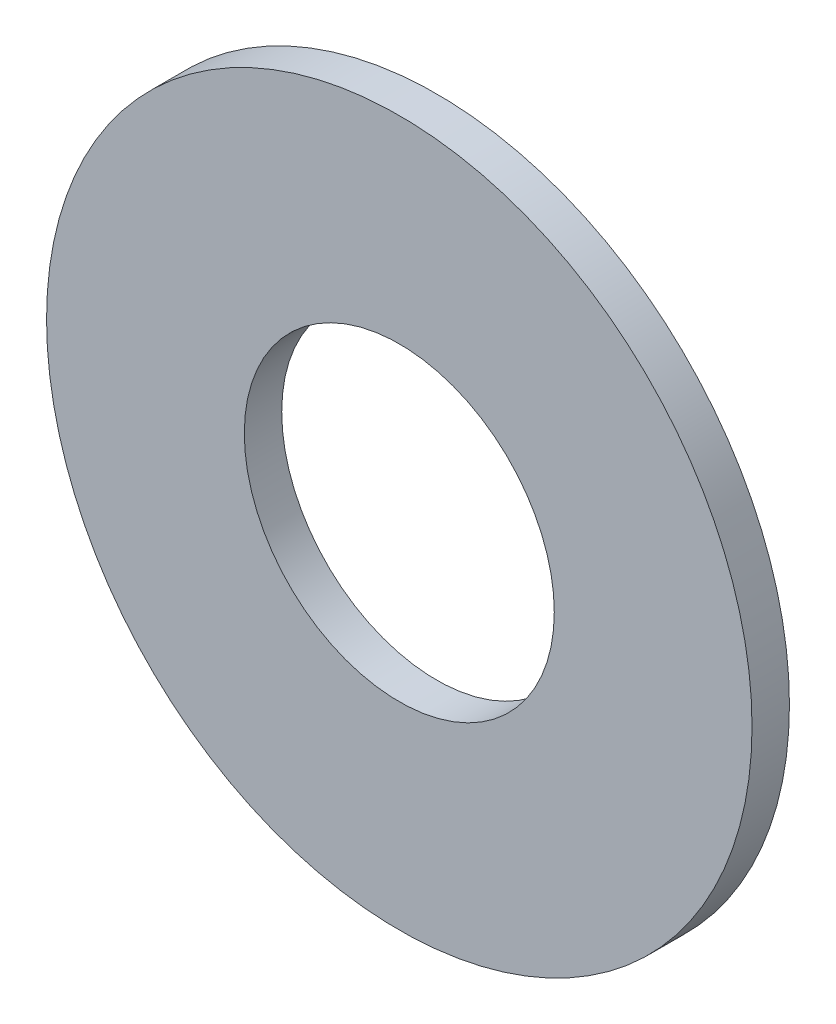
ISO-10303-21;
HEADER;
FILE_DESCRIPTION(('STEP AP214'),'2;1');
FILE_NAME('part.step','',(''),(''),'','','');
FILE_SCHEMA(('AUTOMOTIVE_DESIGN { 1 0 10303 214 1 1 1 1 }'));
ENDSEC;
DATA;
#1=APPLICATION_CONTEXT('core data for automotive mechanical design processes');
#2=APPLICATION_PROTOCOL_DEFINITION('international standard','automotive_design',2000,#1);
#3=PRODUCT_CONTEXT('',#1,'mechanical');
#4=PRODUCT('Part','Part','',(#3));
#5=PRODUCT_RELATED_PRODUCT_CATEGORY('part','',(#4));
#6=PRODUCT_DEFINITION_FORMATION('','',#4);
#7=PRODUCT_DEFINITION_CONTEXT('part definition',#1,'design');
#8=PRODUCT_DEFINITION('design','',#6,#7);
#9=PRODUCT_DEFINITION_SHAPE('','',#8);
#10=(LENGTH_UNIT() NAMED_UNIT(*) SI_UNIT(.MILLI.,.METRE.));
#11=(NAMED_UNIT(*) PLANE_ANGLE_UNIT() SI_UNIT($,.RADIAN.));
#12=(NAMED_UNIT(*) SI_UNIT($,.STERADIAN.) SOLID_ANGLE_UNIT());
#13=UNCERTAINTY_MEASURE_WITH_UNIT(LENGTH_MEASURE(1.E-05),#10,'distance_accuracy_value','');
#14=(GEOMETRIC_REPRESENTATION_CONTEXT(3) GLOBAL_UNCERTAINTY_ASSIGNED_CONTEXT((#13)) GLOBAL_UNIT_ASSIGNED_CONTEXT((#10,
#11,#12)) REPRESENTATION_CONTEXT('',''));
#15=CARTESIAN_POINT('',(0.,0.,0.));
#16=DIRECTION('',(0.,0.,1.));
#17=DIRECTION('',(1.,0.,0.));
#18=AXIS2_PLACEMENT_3D('',#15,#16,#17);
#19=CARTESIAN_POINT('',(0.,0.,1.75));
#20=DIRECTION('',(0.,0.,1.));
#21=DIRECTION('',(1.,0.,0.));
#22=AXIS2_PLACEMENT_3D('',#19,#20,#21);
#23=PLANE('',#22);
#24=CARTESIAN_POINT('',(0.,0.,1.75));
#25=DIRECTION('',(0.,0.,1.));
#26=DIRECTION('',(1.,0.,0.));
#27=AXIS2_PLACEMENT_3D('',#24,#25,#26);
#28=CIRCLE('',#27,33.);
#29=CARTESIAN_POINT('',(33.,0.,1.75));
#30=VERTEX_POINT('',#29);
#31=EDGE_CURVE('E12',#30,#30,#28,.T.);
#32=ORIENTED_EDGE('',*,*,#31,.T.);
#33=EDGE_LOOP('',(#32));
#34=FACE_BOUND('',#33,.T.);
#35=CARTESIAN_POINT('',(0.,0.,1.75));
#36=DIRECTION('',(0.,0.,1.));
#37=DIRECTION('',(1.,0.,0.));
#38=AXIS2_PLACEMENT_3D('',#35,#36,#37);
#39=CIRCLE('',#38,14.5);
#40=CARTESIAN_POINT('',(14.5,0.,1.75));
#41=VERTEX_POINT('',#40);
#42=EDGE_CURVE('E58',#41,#41,#39,.T.);
#43=ORIENTED_EDGE('',*,*,#42,.F.);
#44=EDGE_LOOP('',(#43));
#45=FACE_BOUND('',#44,.T.);
#46=ADVANCED_FACE('F45',(#34,#45),#23,.T.);
#47=CARTESIAN_POINT('',(0.,0.,-1.75));
#48=DIRECTION('',(0.,0.,1.));
#49=DIRECTION('',(1.,0.,0.));
#50=AXIS2_PLACEMENT_3D('',#47,#48,#49);
#51=PLANE('',#50);
#52=CARTESIAN_POINT('',(0.,0.,-1.75));
#53=DIRECTION('',(0.,0.,1.));
#54=DIRECTION('',(1.,0.,0.));
#55=AXIS2_PLACEMENT_3D('',#52,#53,#54);
#56=CIRCLE('',#55,33.);
#57=CARTESIAN_POINT('',(33.,0.,-1.75));
#58=VERTEX_POINT('',#57);
#59=EDGE_CURVE('E49',#58,#58,#56,.T.);
#60=ORIENTED_EDGE('',*,*,#59,.F.);
#61=EDGE_LOOP('',(#60));
#62=FACE_BOUND('',#61,.T.);
#63=CARTESIAN_POINT('',(0.,0.,-1.75));
#64=DIRECTION('',(0.,0.,1.));
#65=DIRECTION('',(1.,0.,0.));
#66=AXIS2_PLACEMENT_3D('',#63,#64,#65);
#67=CIRCLE('',#66,14.5);
#68=CARTESIAN_POINT('',(14.5,0.,-1.75));
#69=VERTEX_POINT('',#68);
#70=EDGE_CURVE('E60',#69,#69,#67,.T.);
#71=ORIENTED_EDGE('',*,*,#70,.T.);
#72=EDGE_LOOP('',(#71));
#73=FACE_BOUND('',#72,.T.);
#74=ADVANCED_FACE('F72',(#62,#73),#51,.F.);
#75=CARTESIAN_POINT('',(0.,0.,1.75));
#76=DIRECTION('',(0.,0.,-1.));
#77=DIRECTION('',(-1.,0.,0.));
#78=AXIS2_PLACEMENT_3D('',#75,#76,#77);
#79=CYLINDRICAL_SURFACE('',#78,33.);
#80=ORIENTED_EDGE('',*,*,#31,.F.);
#81=EDGE_LOOP('',(#80));
#82=FACE_BOUND('',#81,.T.);
#83=ORIENTED_EDGE('',*,*,#59,.T.);
#84=EDGE_LOOP('',(#83));
#85=FACE_BOUND('',#84,.T.);
#86=ADVANCED_FACE('F47',(#82,#85),#79,.T.);
#87=CARTESIAN_POINT('',(0.,0.,1.75));
#88=DIRECTION('',(0.,0.,-1.));
#89=DIRECTION('',(-1.,0.,0.));
#90=AXIS2_PLACEMENT_3D('',#87,#88,#89);
#91=CYLINDRICAL_SURFACE('',#90,14.5);
#92=ORIENTED_EDGE('',*,*,#42,.T.);
#93=EDGE_LOOP('',(#92));
#94=FACE_BOUND('',#93,.T.);
#95=ORIENTED_EDGE('',*,*,#70,.F.);
#96=EDGE_LOOP('',(#95));
#97=FACE_BOUND('',#96,.T.);
#98=ADVANCED_FACE('F68',(#94,#97),#91,.F.);
#99=CLOSED_SHELL('',(#46,#74,#86,#98));
#100=MANIFOLD_SOLID_BREP('B2',#99);
#101=ADVANCED_BREP_SHAPE_REPRESENTATION('',(#18,#100),#14);
#102=SHAPE_DEFINITION_REPRESENTATION(#9,#101);
ENDSEC;
END-ISO-10303-21;
